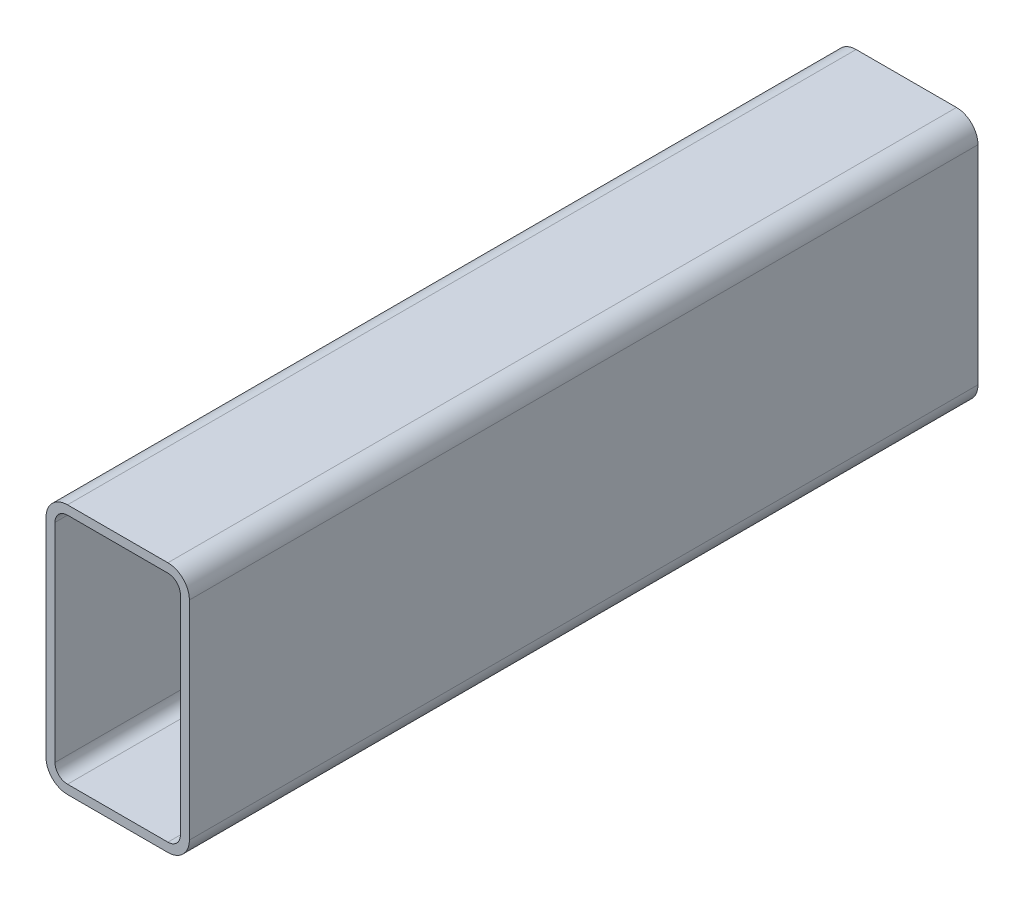
ISO-10303-21;
HEADER;
FILE_DESCRIPTION(('STEP AP214'),'2;1');
FILE_NAME('part.step','',(''),(''),'','','');
FILE_SCHEMA(('AUTOMOTIVE_DESIGN { 1 0 10303 214 1 1 1 1 }'));
ENDSEC;
DATA;
#1=APPLICATION_CONTEXT('core data for automotive mechanical design processes');
#2=APPLICATION_PROTOCOL_DEFINITION('international standard','automotive_design',2000,#1);
#3=PRODUCT_CONTEXT('',#1,'mechanical');
#4=PRODUCT('Part','Part','',(#3));
#5=PRODUCT_RELATED_PRODUCT_CATEGORY('part','',(#4));
#6=PRODUCT_DEFINITION_FORMATION('','',#4);
#7=PRODUCT_DEFINITION_CONTEXT('part definition',#1,'design');
#8=PRODUCT_DEFINITION('design','',#6,#7);
#9=PRODUCT_DEFINITION_SHAPE('','',#8);
#10=(LENGTH_UNIT() NAMED_UNIT(*) SI_UNIT(.MILLI.,.METRE.));
#11=(NAMED_UNIT(*) PLANE_ANGLE_UNIT() SI_UNIT($,.RADIAN.));
#12=(NAMED_UNIT(*) SI_UNIT($,.STERADIAN.) SOLID_ANGLE_UNIT());
#13=UNCERTAINTY_MEASURE_WITH_UNIT(LENGTH_MEASURE(1.E-05),#10,'distance_accuracy_value','');
#14=(GEOMETRIC_REPRESENTATION_CONTEXT(3) GLOBAL_UNCERTAINTY_ASSIGNED_CONTEXT((#13)) GLOBAL_UNIT_ASSIGNED_CONTEXT((#10,
#11,#12)) REPRESENTATION_CONTEXT('',''));
#15=CARTESIAN_POINT('',(0.,0.,0.));
#16=DIRECTION('',(0.,0.,1.));
#17=DIRECTION('',(1.,0.,0.));
#18=AXIS2_PLACEMENT_3D('',#15,#16,#17);
#19=CARTESIAN_POINT('',(12.,322.,440.));
#20=DIRECTION('',(0.,0.,1.));
#21=DIRECTION('',(1.,0.,0.));
#22=AXIS2_PLACEMENT_3D('',#19,#20,#21);
#23=PLANE('',#22);
#24=CARTESIAN_POINT('',(12.,322.,440.));
#25=DIRECTION('',(0.,0.,1.));
#26=DIRECTION('',(1.,0.,0.));
#27=AXIS2_PLACEMENT_3D('',#24,#25,#26);
#28=CIRCLE('',#27,12.);
#29=CARTESIAN_POINT('',(0.,322.,440.));
#30=VERTEX_POINT('',#29);
#31=CARTESIAN_POINT('',(12.,310.,440.));
#32=VERTEX_POINT('',#31);
#33=EDGE_CURVE('E211',#30,#32,#28,.T.);
#34=ORIENTED_EDGE('',*,*,#33,.T.);
#35=DIRECTION('',(1.,0.,0.));
#36=VECTOR('',#35,1.);
#37=CARTESIAN_POINT('',(12.,310.,440.));
#38=LINE('',#37,#36);
#39=CARTESIAN_POINT('',(68.,310.,440.));
#40=VERTEX_POINT('',#39);
#41=EDGE_CURVE('E214',#32,#40,#38,.T.);
#42=ORIENTED_EDGE('',*,*,#41,.T.);
#43=CARTESIAN_POINT('',(68.,322.,440.));
#44=DIRECTION('',(0.,0.,1.));
#45=DIRECTION('',(-1.,0.,0.));
#46=AXIS2_PLACEMENT_3D('',#43,#44,#45);
#47=CIRCLE('',#46,12.);
#48=CARTESIAN_POINT('',(80.,322.,440.));
#49=VERTEX_POINT('',#48);
#50=EDGE_CURVE('E217',#40,#49,#47,.T.);
#51=ORIENTED_EDGE('',*,*,#50,.T.);
#52=DIRECTION('',(0.,1.,0.));
#53=VECTOR('',#52,1.);
#54=CARTESIAN_POINT('',(80.,438.,440.));
#55=LINE('',#54,#53);
#56=CARTESIAN_POINT('',(80.,438.,440.));
#57=VERTEX_POINT('',#56);
#58=EDGE_CURVE('E219',#49,#57,#55,.T.);
#59=ORIENTED_EDGE('',*,*,#58,.T.);
#60=CARTESIAN_POINT('',(68.,438.,440.));
#61=DIRECTION('',(0.,0.,1.));
#62=DIRECTION('',(1.,0.,0.));
#63=AXIS2_PLACEMENT_3D('',#60,#61,#62);
#64=CIRCLE('',#63,12.);
#65=CARTESIAN_POINT('',(68.,450.,440.));
#66=VERTEX_POINT('',#65);
#67=EDGE_CURVE('E221',#57,#66,#64,.T.);
#68=ORIENTED_EDGE('',*,*,#67,.T.);
#69=DIRECTION('',(-1.,0.,0.));
#70=VECTOR('',#69,1.);
#71=CARTESIAN_POINT('',(12.,450.,440.));
#72=LINE('',#71,#70);
#73=CARTESIAN_POINT('',(12.,450.,440.));
#74=VERTEX_POINT('',#73);
#75=EDGE_CURVE('E223',#66,#74,#72,.T.);
#76=ORIENTED_EDGE('',*,*,#75,.T.);
#77=CARTESIAN_POINT('',(12.,438.,440.));
#78=DIRECTION('',(0.,0.,1.));
#79=DIRECTION('',(1.,0.,0.));
#80=AXIS2_PLACEMENT_3D('',#77,#78,#79);
#81=CIRCLE('',#80,12.);
#82=CARTESIAN_POINT('',(0.,438.,440.));
#83=VERTEX_POINT('',#82);
#84=EDGE_CURVE('E225',#74,#83,#81,.T.);
#85=ORIENTED_EDGE('',*,*,#84,.T.);
#86=DIRECTION('',(0.,-1.,0.));
#87=VECTOR('',#86,1.);
#88=CARTESIAN_POINT('',(0.,438.,440.));
#89=LINE('',#88,#87);
#90=EDGE_CURVE('E227',#83,#30,#89,.T.);
#91=ORIENTED_EDGE('',*,*,#90,.T.);
#92=EDGE_LOOP('',(#34,#42,#51,#59,#68,#76,#85,#91));
#93=FACE_BOUND('',#92,.T.);
#94=DIRECTION('',(0.,-1.,0.));
#95=VECTOR('',#94,1.);
#96=CARTESIAN_POINT('',(4.99999999999999,438.,440.));
#97=LINE('',#96,#95);
#98=CARTESIAN_POINT('',(4.99999999999999,438.,440.));
#99=VERTEX_POINT('',#98);
#100=CARTESIAN_POINT('',(5.,322.,440.));
#101=VERTEX_POINT('',#100);
#102=EDGE_CURVE('E154',#99,#101,#97,.T.);
#103=ORIENTED_EDGE('',*,*,#102,.F.);
#104=CARTESIAN_POINT('',(12.,438.,440.));
#105=DIRECTION('',(0.,0.,1.));
#106=DIRECTION('',(1.,0.,0.));
#107=AXIS2_PLACEMENT_3D('',#104,#105,#106);
#108=CIRCLE('',#107,7.);
#109=CARTESIAN_POINT('',(12.,445.,440.));
#110=VERTEX_POINT('',#109);
#111=EDGE_CURVE('E146',#110,#99,#108,.T.);
#112=ORIENTED_EDGE('',*,*,#111,.F.);
#113=DIRECTION('',(-1.,0.,0.));
#114=VECTOR('',#113,1.);
#115=CARTESIAN_POINT('',(12.,445.,440.));
#116=LINE('',#115,#114);
#117=CARTESIAN_POINT('',(68.,445.,440.));
#118=VERTEX_POINT('',#117);
#119=EDGE_CURVE('E179',#118,#110,#116,.T.);
#120=ORIENTED_EDGE('',*,*,#119,.F.);
#121=CARTESIAN_POINT('',(68.,438.,440.));
#122=DIRECTION('',(0.,0.,1.));
#123=DIRECTION('',(1.,0.,0.));
#124=AXIS2_PLACEMENT_3D('',#121,#122,#123);
#125=CIRCLE('',#124,7.);
#126=CARTESIAN_POINT('',(75.,438.,440.));
#127=VERTEX_POINT('',#126);
#128=EDGE_CURVE('E177',#127,#118,#125,.T.);
#129=ORIENTED_EDGE('',*,*,#128,.F.);
#130=DIRECTION('',(0.,1.,0.));
#131=VECTOR('',#130,1.);
#132=CARTESIAN_POINT('',(75.,438.,440.));
#133=LINE('',#132,#131);
#134=CARTESIAN_POINT('',(75.,322.,440.));
#135=VERTEX_POINT('',#134);
#136=EDGE_CURVE('E175',#135,#127,#133,.T.);
#137=ORIENTED_EDGE('',*,*,#136,.F.);
#138=CARTESIAN_POINT('',(68.,322.,440.));
#139=DIRECTION('',(0.,0.,1.));
#140=DIRECTION('',(-1.,0.,0.));
#141=AXIS2_PLACEMENT_3D('',#138,#139,#140);
#142=CIRCLE('',#141,7.);
#143=CARTESIAN_POINT('',(68.,315.,440.));
#144=VERTEX_POINT('',#143);
#145=EDGE_CURVE('E173',#144,#135,#142,.T.);
#146=ORIENTED_EDGE('',*,*,#145,.F.);
#147=DIRECTION('',(1.,0.,0.));
#148=VECTOR('',#147,1.);
#149=CARTESIAN_POINT('',(12.,315.,440.));
#150=LINE('',#149,#148);
#151=CARTESIAN_POINT('',(12.,315.,440.));
#152=VERTEX_POINT('',#151);
#153=EDGE_CURVE('E169',#152,#144,#150,.T.);
#154=ORIENTED_EDGE('',*,*,#153,.F.);
#155=CARTESIAN_POINT('',(12.,322.,440.));
#156=DIRECTION('',(0.,0.,1.));
#157=DIRECTION('',(1.,0.,0.));
#158=AXIS2_PLACEMENT_3D('',#155,#156,#157);
#159=CIRCLE('',#158,7.);
#160=EDGE_CURVE('E167',#101,#152,#159,.T.);
#161=ORIENTED_EDGE('',*,*,#160,.F.);
#162=EDGE_LOOP('',(#103,#112,#120,#129,#137,#146,#154,#161));
#163=FACE_BOUND('',#162,.T.);
#164=ADVANCED_FACE('F33',(#93,#163),#23,.T.);
#165=CARTESIAN_POINT('',(12.,322.,0.));
#166=DIRECTION('',(0.,0.,1.));
#167=DIRECTION('',(1.,0.,0.));
#168=AXIS2_PLACEMENT_3D('',#165,#166,#167);
#169=PLANE('',#168);
#170=CARTESIAN_POINT('',(12.,322.,0.));
#171=DIRECTION('',(0.,0.,1.));
#172=DIRECTION('',(1.,0.,0.));
#173=AXIS2_PLACEMENT_3D('',#170,#171,#172);
#174=CIRCLE('',#173,12.);
#175=CARTESIAN_POINT('',(0.,322.,0.));
#176=VERTEX_POINT('',#175);
#177=CARTESIAN_POINT('',(12.,310.,0.));
#178=VERTEX_POINT('',#177);
#179=EDGE_CURVE('E162',#176,#178,#174,.T.);
#180=ORIENTED_EDGE('',*,*,#179,.F.);
#181=DIRECTION('',(0.,-1.,0.));
#182=VECTOR('',#181,1.);
#183=CARTESIAN_POINT('',(0.,438.,0.));
#184=LINE('',#183,#182);
#185=CARTESIAN_POINT('',(0.,438.,0.));
#186=VERTEX_POINT('',#185);
#187=EDGE_CURVE('E215',#186,#176,#184,.T.);
#188=ORIENTED_EDGE('',*,*,#187,.F.);
#189=CARTESIAN_POINT('',(12.,438.,0.));
#190=DIRECTION('',(0.,0.,1.));
#191=DIRECTION('',(1.,0.,0.));
#192=AXIS2_PLACEMENT_3D('',#189,#190,#191);
#193=CIRCLE('',#192,12.);
#194=CARTESIAN_POINT('',(12.,450.,0.));
#195=VERTEX_POINT('',#194);
#196=EDGE_CURVE('E242',#195,#186,#193,.T.);
#197=ORIENTED_EDGE('',*,*,#196,.F.);
#198=DIRECTION('',(-1.,0.,0.));
#199=VECTOR('',#198,1.);
#200=CARTESIAN_POINT('',(12.,450.,0.));
#201=LINE('',#200,#199);
#202=CARTESIAN_POINT('',(68.,450.,0.));
#203=VERTEX_POINT('',#202);
#204=EDGE_CURVE('E240',#203,#195,#201,.T.);
#205=ORIENTED_EDGE('',*,*,#204,.F.);
#206=CARTESIAN_POINT('',(68.,438.,0.));
#207=DIRECTION('',(0.,0.,1.));
#208=DIRECTION('',(1.,0.,0.));
#209=AXIS2_PLACEMENT_3D('',#206,#207,#208);
#210=CIRCLE('',#209,12.);
#211=CARTESIAN_POINT('',(80.,438.,0.));
#212=VERTEX_POINT('',#211);
#213=EDGE_CURVE('E238',#212,#203,#210,.T.);
#214=ORIENTED_EDGE('',*,*,#213,.F.);
#215=DIRECTION('',(0.,1.,0.));
#216=VECTOR('',#215,1.);
#217=CARTESIAN_POINT('',(80.,438.,0.));
#218=LINE('',#217,#216);
#219=CARTESIAN_POINT('',(80.,322.,0.));
#220=VERTEX_POINT('',#219);
#221=EDGE_CURVE('E236',#220,#212,#218,.T.);
#222=ORIENTED_EDGE('',*,*,#221,.F.);
#223=CARTESIAN_POINT('',(68.,322.,0.));
#224=DIRECTION('',(0.,0.,1.));
#225=DIRECTION('',(-1.,0.,0.));
#226=AXIS2_PLACEMENT_3D('',#223,#224,#225);
#227=CIRCLE('',#226,12.);
#228=CARTESIAN_POINT('',(68.,310.,0.));
#229=VERTEX_POINT('',#228);
#230=EDGE_CURVE('E234',#229,#220,#227,.T.);
#231=ORIENTED_EDGE('',*,*,#230,.F.);
#232=DIRECTION('',(1.,0.,0.));
#233=VECTOR('',#232,1.);
#234=CARTESIAN_POINT('',(12.,310.,0.));
#235=LINE('',#234,#233);
#236=EDGE_CURVE('E232',#178,#229,#235,.T.);
#237=ORIENTED_EDGE('',*,*,#236,.F.);
#238=EDGE_LOOP('',(#180,#188,#197,#205,#214,#222,#231,#237));
#239=FACE_BOUND('',#238,.T.);
#240=CARTESIAN_POINT('',(12.,438.,0.));
#241=DIRECTION('',(0.,0.,1.));
#242=DIRECTION('',(1.,0.,0.));
#243=AXIS2_PLACEMENT_3D('',#240,#241,#242);
#244=CIRCLE('',#243,7.);
#245=CARTESIAN_POINT('',(12.,445.,0.));
#246=VERTEX_POINT('',#245);
#247=CARTESIAN_POINT('',(4.99999999999999,438.,0.));
#248=VERTEX_POINT('',#247);
#249=EDGE_CURVE('E56',#246,#248,#244,.T.);
#250=ORIENTED_EDGE('',*,*,#249,.T.);
#251=DIRECTION('',(0.,-1.,0.));
#252=VECTOR('',#251,1.);
#253=CARTESIAN_POINT('',(4.99999999999999,438.,0.));
#254=LINE('',#253,#252);
#255=CARTESIAN_POINT('',(5.,322.,0.));
#256=VERTEX_POINT('',#255);
#257=EDGE_CURVE('E161',#248,#256,#254,.T.);
#258=ORIENTED_EDGE('',*,*,#257,.T.);
#259=CARTESIAN_POINT('',(12.,322.,0.));
#260=DIRECTION('',(0.,0.,1.));
#261=DIRECTION('',(1.,0.,0.));
#262=AXIS2_PLACEMENT_3D('',#259,#260,#261);
#263=CIRCLE('',#262,7.);
#264=CARTESIAN_POINT('',(12.,315.,0.));
#265=VERTEX_POINT('',#264);
#266=EDGE_CURVE('E183',#256,#265,#263,.T.);
#267=ORIENTED_EDGE('',*,*,#266,.T.);
#268=DIRECTION('',(1.,0.,0.));
#269=VECTOR('',#268,1.);
#270=CARTESIAN_POINT('',(12.,315.,0.));
#271=LINE('',#270,#269);
#272=CARTESIAN_POINT('',(68.,315.,0.));
#273=VERTEX_POINT('',#272);
#274=EDGE_CURVE('E186',#265,#273,#271,.T.);
#275=ORIENTED_EDGE('',*,*,#274,.T.);
#276=CARTESIAN_POINT('',(68.,322.,0.));
#277=DIRECTION('',(0.,0.,1.));
#278=DIRECTION('',(-1.,0.,0.));
#279=AXIS2_PLACEMENT_3D('',#276,#277,#278);
#280=CIRCLE('',#279,7.);
#281=CARTESIAN_POINT('',(75.,322.,0.));
#282=VERTEX_POINT('',#281);
#283=EDGE_CURVE('E189',#273,#282,#280,.T.);
#284=ORIENTED_EDGE('',*,*,#283,.T.);
#285=DIRECTION('',(0.,1.,0.));
#286=VECTOR('',#285,1.);
#287=CARTESIAN_POINT('',(75.,438.,0.));
#288=LINE('',#287,#286);
#289=CARTESIAN_POINT('',(75.,438.,0.));
#290=VERTEX_POINT('',#289);
#291=EDGE_CURVE('E192',#282,#290,#288,.T.);
#292=ORIENTED_EDGE('',*,*,#291,.T.);
#293=CARTESIAN_POINT('',(68.,438.,0.));
#294=DIRECTION('',(0.,0.,1.));
#295=DIRECTION('',(1.,0.,0.));
#296=AXIS2_PLACEMENT_3D('',#293,#294,#295);
#297=CIRCLE('',#296,7.);
#298=CARTESIAN_POINT('',(68.,445.,0.));
#299=VERTEX_POINT('',#298);
#300=EDGE_CURVE('E195',#290,#299,#297,.T.);
#301=ORIENTED_EDGE('',*,*,#300,.T.);
#302=DIRECTION('',(-1.,0.,0.));
#303=VECTOR('',#302,1.);
#304=CARTESIAN_POINT('',(12.,445.,0.));
#305=LINE('',#304,#303);
#306=EDGE_CURVE('E155',#299,#246,#305,.T.);
#307=ORIENTED_EDGE('',*,*,#306,.T.);
#308=EDGE_LOOP('',(#250,#258,#267,#275,#284,#292,#301,#307));
#309=FACE_BOUND('',#308,.T.);
#310=ADVANCED_FACE('F272',(#239,#309),#169,.F.);
#311=CARTESIAN_POINT('',(12.,322.,440.));
#312=DIRECTION('',(0.,0.,-1.));
#313=DIRECTION('',(-1.,0.,0.));
#314=AXIS2_PLACEMENT_3D('',#311,#312,#313);
#315=CYLINDRICAL_SURFACE('',#314,12.);
#316=ORIENTED_EDGE('',*,*,#179,.T.);
#317=DIRECTION('',(0.,0.,-1.));
#318=VECTOR('',#317,1.);
#319=CARTESIAN_POINT('',(12.,310.,440.));
#320=LINE('',#319,#318);
#321=EDGE_CURVE('E11',#32,#178,#320,.T.);
#322=ORIENTED_EDGE('',*,*,#321,.F.);
#323=ORIENTED_EDGE('',*,*,#33,.F.);
#324=DIRECTION('',(0.,0.,-1.));
#325=VECTOR('',#324,1.);
#326=CARTESIAN_POINT('',(0.,322.,440.));
#327=LINE('',#326,#325);
#328=EDGE_CURVE('E229',#30,#176,#327,.T.);
#329=ORIENTED_EDGE('',*,*,#328,.T.);
#330=EDGE_LOOP('',(#316,#322,#323,#329));
#331=FACE_BOUND('',#330,.T.);
#332=ADVANCED_FACE('F35',(#331),#315,.T.);
#333=CARTESIAN_POINT('',(12.,310.,440.));
#334=DIRECTION('',(0.,1.,0.));
#335=DIRECTION('',(0.,0.,1.));
#336=AXIS2_PLACEMENT_3D('',#333,#334,#335);
#337=PLANE('',#336);
#338=ORIENTED_EDGE('',*,*,#236,.T.);
#339=DIRECTION('',(0.,0.,-1.));
#340=VECTOR('',#339,1.);
#341=CARTESIAN_POINT('',(68.,310.,440.));
#342=LINE('',#341,#340);
#343=EDGE_CURVE('E41',#40,#229,#342,.T.);
#344=ORIENTED_EDGE('',*,*,#343,.F.);
#345=ORIENTED_EDGE('',*,*,#41,.F.);
#346=ORIENTED_EDGE('',*,*,#321,.T.);
#347=EDGE_LOOP('',(#338,#344,#345,#346));
#348=FACE_BOUND('',#347,.T.);
#349=ADVANCED_FACE('F289',(#348),#337,.F.);
#350=CARTESIAN_POINT('',(68.,322.,440.));
#351=DIRECTION('',(0.,0.,-1.));
#352=DIRECTION('',(-1.,0.,0.));
#353=AXIS2_PLACEMENT_3D('',#350,#351,#352);
#354=CYLINDRICAL_SURFACE('',#353,12.);
#355=ORIENTED_EDGE('',*,*,#230,.T.);
#356=DIRECTION('',(0.,0.,-1.));
#357=VECTOR('',#356,1.);
#358=CARTESIAN_POINT('',(80.,322.,440.));
#359=LINE('',#358,#357);
#360=EDGE_CURVE('E259',#49,#220,#359,.T.);
#361=ORIENTED_EDGE('',*,*,#360,.F.);
#362=ORIENTED_EDGE('',*,*,#50,.F.);
#363=ORIENTED_EDGE('',*,*,#343,.T.);
#364=EDGE_LOOP('',(#355,#361,#362,#363));
#365=FACE_BOUND('',#364,.T.);
#366=ADVANCED_FACE('F266',(#365),#354,.T.);
#367=CARTESIAN_POINT('',(80.,438.,440.));
#368=DIRECTION('',(-1.,0.,0.));
#369=DIRECTION('',(0.,-1.,0.));
#370=AXIS2_PLACEMENT_3D('',#367,#368,#369);
#371=PLANE('',#370);
#372=ORIENTED_EDGE('',*,*,#221,.T.);
#373=DIRECTION('',(0.,0.,-1.));
#374=VECTOR('',#373,1.);
#375=CARTESIAN_POINT('',(80.,438.,440.));
#376=LINE('',#375,#374);
#377=EDGE_CURVE('E256',#57,#212,#376,.T.);
#378=ORIENTED_EDGE('',*,*,#377,.F.);
#379=ORIENTED_EDGE('',*,*,#58,.F.);
#380=ORIENTED_EDGE('',*,*,#360,.T.);
#381=EDGE_LOOP('',(#372,#378,#379,#380));
#382=FACE_BOUND('',#381,.T.);
#383=ADVANCED_FACE('F278',(#382),#371,.F.);
#384=CARTESIAN_POINT('',(68.,438.,440.));
#385=DIRECTION('',(0.,0.,-1.));
#386=DIRECTION('',(-1.,0.,0.));
#387=AXIS2_PLACEMENT_3D('',#384,#385,#386);
#388=CYLINDRICAL_SURFACE('',#387,12.);
#389=ORIENTED_EDGE('',*,*,#213,.T.);
#390=DIRECTION('',(0.,0.,-1.));
#391=VECTOR('',#390,1.);
#392=CARTESIAN_POINT('',(68.,450.,440.));
#393=LINE('',#392,#391);
#394=EDGE_CURVE('E253',#66,#203,#393,.T.);
#395=ORIENTED_EDGE('',*,*,#394,.F.);
#396=ORIENTED_EDGE('',*,*,#67,.F.);
#397=ORIENTED_EDGE('',*,*,#377,.T.);
#398=EDGE_LOOP('',(#389,#395,#396,#397));
#399=FACE_BOUND('',#398,.T.);
#400=ADVANCED_FACE('F282',(#399),#388,.T.);
#401=CARTESIAN_POINT('',(12.,450.,440.));
#402=DIRECTION('',(0.,-1.,0.));
#403=DIRECTION('',(0.,0.,-1.));
#404=AXIS2_PLACEMENT_3D('',#401,#402,#403);
#405=PLANE('',#404);
#406=ORIENTED_EDGE('',*,*,#204,.T.);
#407=DIRECTION('',(0.,0.,-1.));
#408=VECTOR('',#407,1.);
#409=CARTESIAN_POINT('',(12.,450.,440.));
#410=LINE('',#409,#408);
#411=EDGE_CURVE('E250',#74,#195,#410,.T.);
#412=ORIENTED_EDGE('',*,*,#411,.F.);
#413=ORIENTED_EDGE('',*,*,#75,.F.);
#414=ORIENTED_EDGE('',*,*,#394,.T.);
#415=EDGE_LOOP('',(#406,#412,#413,#414));
#416=FACE_BOUND('',#415,.T.);
#417=ADVANCED_FACE('F302',(#416),#405,.F.);
#418=CARTESIAN_POINT('',(12.,438.,440.));
#419=DIRECTION('',(0.,0.,-1.));
#420=DIRECTION('',(-1.,0.,0.));
#421=AXIS2_PLACEMENT_3D('',#418,#419,#420);
#422=CYLINDRICAL_SURFACE('',#421,12.);
#423=ORIENTED_EDGE('',*,*,#196,.T.);
#424=DIRECTION('',(0.,0.,-1.));
#425=VECTOR('',#424,1.);
#426=CARTESIAN_POINT('',(0.,438.,440.));
#427=LINE('',#426,#425);
#428=EDGE_CURVE('E247',#83,#186,#427,.T.);
#429=ORIENTED_EDGE('',*,*,#428,.F.);
#430=ORIENTED_EDGE('',*,*,#84,.F.);
#431=ORIENTED_EDGE('',*,*,#411,.T.);
#432=EDGE_LOOP('',(#423,#429,#430,#431));
#433=FACE_BOUND('',#432,.T.);
#434=ADVANCED_FACE('F300',(#433),#422,.T.);
#435=CARTESIAN_POINT('',(0.,438.,440.));
#436=DIRECTION('',(1.,0.,0.));
#437=DIRECTION('',(0.,1.,0.));
#438=AXIS2_PLACEMENT_3D('',#435,#436,#437);
#439=PLANE('',#438);
#440=ORIENTED_EDGE('',*,*,#187,.T.);
#441=ORIENTED_EDGE('',*,*,#328,.F.);
#442=ORIENTED_EDGE('',*,*,#90,.F.);
#443=ORIENTED_EDGE('',*,*,#428,.T.);
#444=EDGE_LOOP('',(#440,#441,#442,#443));
#445=FACE_BOUND('',#444,.T.);
#446=ADVANCED_FACE('F295',(#445),#439,.F.);
#447=CARTESIAN_POINT('',(12.,438.,440.));
#448=DIRECTION('',(0.,0.,-1.));
#449=DIRECTION('',(-1.,0.,0.));
#450=AXIS2_PLACEMENT_3D('',#447,#448,#449);
#451=CYLINDRICAL_SURFACE('',#450,7.);
#452=ORIENTED_EDGE('',*,*,#249,.F.);
#453=DIRECTION('',(0.,0.,-1.));
#454=VECTOR('',#453,1.);
#455=CARTESIAN_POINT('',(12.,445.,440.));
#456=LINE('',#455,#454);
#457=EDGE_CURVE('E150',#110,#246,#456,.T.);
#458=ORIENTED_EDGE('',*,*,#457,.F.);
#459=ORIENTED_EDGE('',*,*,#111,.T.);
#460=DIRECTION('',(0.,0.,-1.));
#461=VECTOR('',#460,1.);
#462=CARTESIAN_POINT('',(4.99999999999999,438.,440.));
#463=LINE('',#462,#461);
#464=EDGE_CURVE('E149',#99,#248,#463,.T.);
#465=ORIENTED_EDGE('',*,*,#464,.T.);
#466=EDGE_LOOP('',(#452,#458,#459,#465));
#467=FACE_BOUND('',#466,.T.);
#468=ADVANCED_FACE('F148',(#467),#451,.F.);
#469=CARTESIAN_POINT('',(4.99999999999999,438.,440.));
#470=DIRECTION('',(1.,0.,0.));
#471=DIRECTION('',(0.,1.,0.));
#472=AXIS2_PLACEMENT_3D('',#469,#470,#471);
#473=PLANE('',#472);
#474=ORIENTED_EDGE('',*,*,#257,.F.);
#475=ORIENTED_EDGE('',*,*,#464,.F.);
#476=ORIENTED_EDGE('',*,*,#102,.T.);
#477=DIRECTION('',(0.,0.,-1.));
#478=VECTOR('',#477,1.);
#479=CARTESIAN_POINT('',(5.,322.,440.));
#480=LINE('',#479,#478);
#481=EDGE_CURVE('E163',#101,#256,#480,.T.);
#482=ORIENTED_EDGE('',*,*,#481,.T.);
#483=EDGE_LOOP('',(#474,#475,#476,#482));
#484=FACE_BOUND('',#483,.T.);
#485=ADVANCED_FACE('F158',(#484),#473,.T.);
#486=CARTESIAN_POINT('',(12.,322.,440.));
#487=DIRECTION('',(0.,0.,-1.));
#488=DIRECTION('',(-1.,0.,0.));
#489=AXIS2_PLACEMENT_3D('',#486,#487,#488);
#490=CYLINDRICAL_SURFACE('',#489,7.);
#491=ORIENTED_EDGE('',*,*,#266,.F.);
#492=ORIENTED_EDGE('',*,*,#481,.F.);
#493=ORIENTED_EDGE('',*,*,#160,.T.);
#494=DIRECTION('',(0.,0.,-1.));
#495=VECTOR('',#494,1.);
#496=CARTESIAN_POINT('',(12.,315.,440.));
#497=LINE('',#496,#495);
#498=EDGE_CURVE('E208',#152,#265,#497,.T.);
#499=ORIENTED_EDGE('',*,*,#498,.T.);
#500=EDGE_LOOP('',(#491,#492,#493,#499));
#501=FACE_BOUND('',#500,.T.);
#502=ADVANCED_FACE('F327',(#501),#490,.F.);
#503=CARTESIAN_POINT('',(12.,315.,440.));
#504=DIRECTION('',(0.,1.,0.));
#505=DIRECTION('',(0.,0.,1.));
#506=AXIS2_PLACEMENT_3D('',#503,#504,#505);
#507=PLANE('',#506);
#508=ORIENTED_EDGE('',*,*,#274,.F.);
#509=ORIENTED_EDGE('',*,*,#498,.F.);
#510=ORIENTED_EDGE('',*,*,#153,.T.);
#511=DIRECTION('',(0.,0.,-1.));
#512=VECTOR('',#511,1.);
#513=CARTESIAN_POINT('',(68.,315.,440.));
#514=LINE('',#513,#512);
#515=EDGE_CURVE('E206',#144,#273,#514,.T.);
#516=ORIENTED_EDGE('',*,*,#515,.T.);
#517=EDGE_LOOP('',(#508,#509,#510,#516));
#518=FACE_BOUND('',#517,.T.);
#519=ADVANCED_FACE('F331',(#518),#507,.T.);
#520=CARTESIAN_POINT('',(68.,322.,440.));
#521=DIRECTION('',(0.,0.,-1.));
#522=DIRECTION('',(-1.,0.,0.));
#523=AXIS2_PLACEMENT_3D('',#520,#521,#522);
#524=CYLINDRICAL_SURFACE('',#523,7.);
#525=ORIENTED_EDGE('',*,*,#283,.F.);
#526=ORIENTED_EDGE('',*,*,#515,.F.);
#527=ORIENTED_EDGE('',*,*,#145,.T.);
#528=DIRECTION('',(0.,0.,-1.));
#529=VECTOR('',#528,1.);
#530=CARTESIAN_POINT('',(75.,322.,440.));
#531=LINE('',#530,#529);
#532=EDGE_CURVE('E204',#135,#282,#531,.T.);
#533=ORIENTED_EDGE('',*,*,#532,.T.);
#534=EDGE_LOOP('',(#525,#526,#527,#533));
#535=FACE_BOUND('',#534,.T.);
#536=ADVANCED_FACE('F337',(#535),#524,.F.);
#537=CARTESIAN_POINT('',(75.,438.,440.));
#538=DIRECTION('',(-1.,0.,0.));
#539=DIRECTION('',(0.,-1.,0.));
#540=AXIS2_PLACEMENT_3D('',#537,#538,#539);
#541=PLANE('',#540);
#542=ORIENTED_EDGE('',*,*,#291,.F.);
#543=ORIENTED_EDGE('',*,*,#532,.F.);
#544=ORIENTED_EDGE('',*,*,#136,.T.);
#545=DIRECTION('',(0.,0.,-1.));
#546=VECTOR('',#545,1.);
#547=CARTESIAN_POINT('',(75.,438.,440.));
#548=LINE('',#547,#546);
#549=EDGE_CURVE('E202',#127,#290,#548,.T.);
#550=ORIENTED_EDGE('',*,*,#549,.T.);
#551=EDGE_LOOP('',(#542,#543,#544,#550));
#552=FACE_BOUND('',#551,.T.);
#553=ADVANCED_FACE('F341',(#552),#541,.T.);
#554=CARTESIAN_POINT('',(68.,438.,440.));
#555=DIRECTION('',(0.,0.,-1.));
#556=DIRECTION('',(-1.,0.,0.));
#557=AXIS2_PLACEMENT_3D('',#554,#555,#556);
#558=CYLINDRICAL_SURFACE('',#557,7.);
#559=ORIENTED_EDGE('',*,*,#300,.F.);
#560=ORIENTED_EDGE('',*,*,#549,.F.);
#561=ORIENTED_EDGE('',*,*,#128,.T.);
#562=DIRECTION('',(0.,0.,-1.));
#563=VECTOR('',#562,1.);
#564=CARTESIAN_POINT('',(68.,445.,440.));
#565=LINE('',#564,#563);
#566=EDGE_CURVE('E48',#118,#299,#565,.T.);
#567=ORIENTED_EDGE('',*,*,#566,.T.);
#568=EDGE_LOOP('',(#559,#560,#561,#567));
#569=FACE_BOUND('',#568,.T.);
#570=ADVANCED_FACE('F345',(#569),#558,.F.);
#571=CARTESIAN_POINT('',(12.,445.,440.));
#572=DIRECTION('',(0.,-1.,0.));
#573=DIRECTION('',(0.,0.,-1.));
#574=AXIS2_PLACEMENT_3D('',#571,#572,#573);
#575=PLANE('',#574);
#576=ORIENTED_EDGE('',*,*,#306,.F.);
#577=ORIENTED_EDGE('',*,*,#566,.F.);
#578=ORIENTED_EDGE('',*,*,#119,.T.);
#579=ORIENTED_EDGE('',*,*,#457,.T.);
#580=EDGE_LOOP('',(#576,#577,#578,#579));
#581=FACE_BOUND('',#580,.T.);
#582=ADVANCED_FACE('F349',(#581),#575,.T.);
#583=CLOSED_SHELL('',(#164,#310,#332,#349,#366,#383,#400,#417,#434,#446,#468,#485,#502,#519,
#536,#553,#570,#582));
#584=MANIFOLD_SOLID_BREP('B2',#583);
#585=ADVANCED_BREP_SHAPE_REPRESENTATION('',(#18,#584),#14);
#586=SHAPE_DEFINITION_REPRESENTATION(#9,#585);
ENDSEC;
END-ISO-10303-21;
